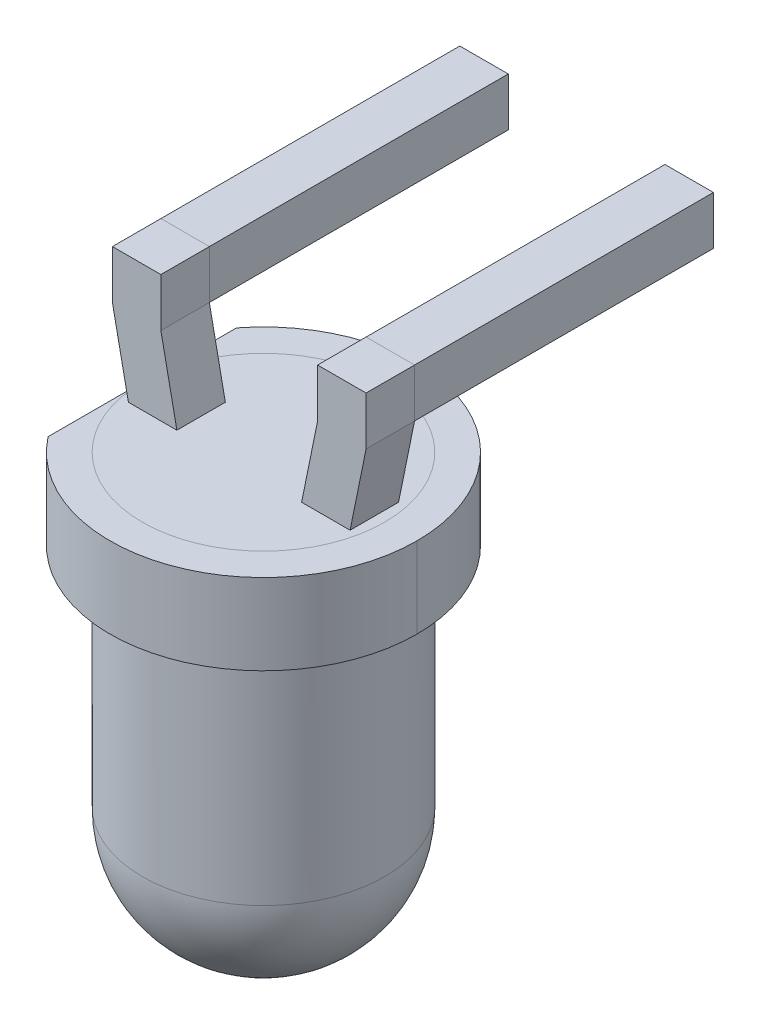
ISO-10303-21;
HEADER;
FILE_DESCRIPTION(('STEP AP214'),'2;1');
FILE_NAME('part.step','',(''),(''),'','','');
FILE_SCHEMA(('AUTOMOTIVE_DESIGN { 1 0 10303 214 1 1 1 1 }'));
ENDSEC;
DATA;
#1=APPLICATION_CONTEXT('core data for automotive mechanical design processes');
#2=APPLICATION_PROTOCOL_DEFINITION('international standard','automotive_design',2000,#1);
#3=PRODUCT_CONTEXT('',#1,'mechanical');
#4=PRODUCT('Part','Part','',(#3));
#5=PRODUCT_RELATED_PRODUCT_CATEGORY('part','',(#4));
#6=PRODUCT_DEFINITION_FORMATION('','',#4);
#7=PRODUCT_DEFINITION_CONTEXT('part definition',#1,'design');
#8=PRODUCT_DEFINITION('design','',#6,#7);
#9=PRODUCT_DEFINITION_SHAPE('','',#8);
#10=(LENGTH_UNIT() NAMED_UNIT(*) SI_UNIT(.MILLI.,.METRE.));
#11=(NAMED_UNIT(*) PLANE_ANGLE_UNIT() SI_UNIT($,.RADIAN.));
#12=(NAMED_UNIT(*) SI_UNIT($,.STERADIAN.) SOLID_ANGLE_UNIT());
#13=UNCERTAINTY_MEASURE_WITH_UNIT(LENGTH_MEASURE(1.E-05),#10,'distance_accuracy_value','');
#14=(GEOMETRIC_REPRESENTATION_CONTEXT(3) GLOBAL_UNCERTAINTY_ASSIGNED_CONTEXT((#13)) GLOBAL_UNIT_ASSIGNED_CONTEXT((#10,
#11,#12)) REPRESENTATION_CONTEXT('',''));
#15=CARTESIAN_POINT('',(0.,0.,0.));
#16=DIRECTION('',(0.,0.,1.));
#17=DIRECTION('',(1.,0.,0.));
#18=AXIS2_PLACEMENT_3D('',#15,#16,#17);
#19=CARTESIAN_POINT('',(2.84,0.3,-2.));
#20=DIRECTION('',(0.,0.,-1.));
#21=DIRECTION('',(0.,-1.,0.));
#22=AXIS2_PLACEMENT_3D('',#19,#20,#21);
#23=PLANE('',#22);
#24=DIRECTION('',(0.,1.,0.));
#25=VECTOR('',#24,1.);
#26=CARTESIAN_POINT('',(2.84,-0.3,-2.));
#27=LINE('',#26,#25);
#28=CARTESIAN_POINT('',(2.84,-0.3,-2.));
#29=VERTEX_POINT('',#28);
#30=CARTESIAN_POINT('',(2.84,0.3,-2.));
#31=VERTEX_POINT('',#30);
#32=EDGE_CURVE('E11',#29,#31,#27,.T.);
#33=ORIENTED_EDGE('',*,*,#32,.F.);
#34=DIRECTION('',(1.,0.,0.));
#35=VECTOR('',#34,1.);
#36=CARTESIAN_POINT('',(2.24,-0.3,-2.));
#37=LINE('',#36,#35);
#38=CARTESIAN_POINT('',(2.24,-0.3,-2.));
#39=VERTEX_POINT('',#38);
#40=EDGE_CURVE('E293',#39,#29,#37,.T.);
#41=ORIENTED_EDGE('',*,*,#40,.F.);
#42=DIRECTION('',(0.,-1.,0.));
#43=VECTOR('',#42,1.);
#44=CARTESIAN_POINT('',(2.24,0.3,-2.));
#45=LINE('',#44,#43);
#46=CARTESIAN_POINT('',(2.24,0.3,-2.));
#47=VERTEX_POINT('',#46);
#48=EDGE_CURVE('E27',#47,#39,#45,.T.);
#49=ORIENTED_EDGE('',*,*,#48,.F.);
#50=DIRECTION('',(-1.,0.,0.));
#51=VECTOR('',#50,1.);
#52=CARTESIAN_POINT('',(2.84,0.3,-2.));
#53=LINE('',#52,#51);
#54=EDGE_CURVE('E246',#31,#47,#53,.T.);
#55=ORIENTED_EDGE('',*,*,#54,.F.);
#56=EDGE_LOOP('',(#33,#41,#49,#55));
#57=FACE_BOUND('',#56,.T.);
#58=ADVANCED_FACE('F17',(#57),#23,.T.);
#59=CARTESIAN_POINT('',(2.84,-0.3,-2.));
#60=DIRECTION('',(-1.,0.,0.));
#61=DIRECTION('',(0.,0.,1.));
#62=AXIS2_PLACEMENT_3D('',#59,#60,#61);
#63=PLANE('',#62);
#64=ORIENTED_EDGE('',*,*,#32,.T.);
#65=DIRECTION('',(0.,0.,1.));
#66=VECTOR('',#65,1.);
#67=CARTESIAN_POINT('',(2.84,0.3,-2.));
#68=LINE('',#67,#66);
#69=CARTESIAN_POINT('',(2.84,0.3,1.7));
#70=VERTEX_POINT('',#69);
#71=EDGE_CURVE('E274',#31,#70,#68,.T.);
#72=ORIENTED_EDGE('',*,*,#71,.T.);
#73=DIRECTION('',(0.,-1.,0.));
#74=VECTOR('',#73,1.);
#75=CARTESIAN_POINT('',(2.84,0.3,1.7));
#76=LINE('',#75,#74);
#77=CARTESIAN_POINT('',(2.84,-0.3,1.7));
#78=VERTEX_POINT('',#77);
#79=EDGE_CURVE('E290',#70,#78,#76,.T.);
#80=ORIENTED_EDGE('',*,*,#79,.T.);
#81=DIRECTION('',(0.,0.,1.));
#82=VECTOR('',#81,1.);
#83=CARTESIAN_POINT('',(2.84,-0.3,-2.));
#84=LINE('',#83,#82);
#85=EDGE_CURVE('E398',#29,#78,#84,.T.);
#86=ORIENTED_EDGE('',*,*,#85,.F.);
#87=EDGE_LOOP('',(#64,#72,#80,#86));
#88=FACE_BOUND('',#87,.T.);
#89=ADVANCED_FACE('F500',(#88),#63,.F.);
#90=CARTESIAN_POINT('',(2.24,0.3,-2.));
#91=DIRECTION('',(1.,0.,0.));
#92=DIRECTION('',(0.,1.,0.));
#93=AXIS2_PLACEMENT_3D('',#90,#91,#92);
#94=PLANE('',#93);
#95=ORIENTED_EDGE('',*,*,#48,.T.);
#96=DIRECTION('',(0.,0.,1.));
#97=VECTOR('',#96,1.);
#98=CARTESIAN_POINT('',(2.24,-0.3,-2.));
#99=LINE('',#98,#97);
#100=CARTESIAN_POINT('',(2.24,-0.3,1.7));
#101=VERTEX_POINT('',#100);
#102=EDGE_CURVE('E402',#39,#101,#99,.T.);
#103=ORIENTED_EDGE('',*,*,#102,.T.);
#104=DIRECTION('',(0.,-1.,0.));
#105=VECTOR('',#104,1.);
#106=CARTESIAN_POINT('',(2.24,0.3,1.7));
#107=LINE('',#106,#105);
#108=CARTESIAN_POINT('',(2.24,0.3,1.7));
#109=VERTEX_POINT('',#108);
#110=EDGE_CURVE('E294',#109,#101,#107,.T.);
#111=ORIENTED_EDGE('',*,*,#110,.F.);
#112=DIRECTION('',(0.,0.,1.));
#113=VECTOR('',#112,1.);
#114=CARTESIAN_POINT('',(2.24,0.3,-2.));
#115=LINE('',#114,#113);
#116=EDGE_CURVE('E300',#47,#109,#115,.T.);
#117=ORIENTED_EDGE('',*,*,#116,.F.);
#118=EDGE_LOOP('',(#95,#103,#111,#117));
#119=FACE_BOUND('',#118,.T.);
#120=ADVANCED_FACE('F505',(#119),#94,.F.);
#121=CARTESIAN_POINT('',(2.84,0.3,-2.));
#122=DIRECTION('',(0.,-1.,0.));
#123=DIRECTION('',(0.,0.,-1.));
#124=AXIS2_PLACEMENT_3D('',#121,#122,#123);
#125=PLANE('',#124);
#126=ORIENTED_EDGE('',*,*,#54,.T.);
#127=ORIENTED_EDGE('',*,*,#116,.T.);
#128=DIRECTION('',(-1.,0.,0.));
#129=VECTOR('',#128,1.);
#130=CARTESIAN_POINT('',(2.84,0.3,1.7));
#131=LINE('',#130,#129);
#132=EDGE_CURVE('E967',#70,#109,#131,.T.);
#133=ORIENTED_EDGE('',*,*,#132,.F.);
#134=ORIENTED_EDGE('',*,*,#71,.F.);
#135=EDGE_LOOP('',(#126,#127,#133,#134));
#136=FACE_BOUND('',#135,.T.);
#137=ADVANCED_FACE('F513',(#136),#125,.F.);
#138=CARTESIAN_POINT('',(0.3,0.3,-2.));
#139=DIRECTION('',(0.,-1.,0.));
#140=DIRECTION('',(0.,0.,-1.));
#141=AXIS2_PLACEMENT_3D('',#138,#139,#140);
#142=PLANE('',#141);
#143=DIRECTION('',(-1.,0.,0.));
#144=VECTOR('',#143,1.);
#145=CARTESIAN_POINT('',(0.3,0.3,-2.));
#146=LINE('',#145,#144);
#147=CARTESIAN_POINT('',(0.3,0.3,-2.));
#148=VERTEX_POINT('',#147);
#149=CARTESIAN_POINT('',(-0.3,0.3,-2.));
#150=VERTEX_POINT('',#149);
#151=EDGE_CURVE('E234',#148,#150,#146,.T.);
#152=ORIENTED_EDGE('',*,*,#151,.T.);
#153=DIRECTION('',(0.,0.,1.));
#154=VECTOR('',#153,1.);
#155=CARTESIAN_POINT('',(-0.3,0.3,-2.));
#156=LINE('',#155,#154);
#157=CARTESIAN_POINT('',(-0.3,0.3,1.7));
#158=VERTEX_POINT('',#157);
#159=EDGE_CURVE('E238',#150,#158,#156,.T.);
#160=ORIENTED_EDGE('',*,*,#159,.T.);
#161=DIRECTION('',(-1.,0.,0.));
#162=VECTOR('',#161,1.);
#163=CARTESIAN_POINT('',(0.3,0.3,1.7));
#164=LINE('',#163,#162);
#165=CARTESIAN_POINT('',(0.3,0.3,1.7));
#166=VERTEX_POINT('',#165);
#167=EDGE_CURVE('E964',#166,#158,#164,.T.);
#168=ORIENTED_EDGE('',*,*,#167,.F.);
#169=DIRECTION('',(0.,0.,1.));
#170=VECTOR('',#169,1.);
#171=CARTESIAN_POINT('',(0.3,0.3,-2.));
#172=LINE('',#171,#170);
#173=EDGE_CURVE('E241',#148,#166,#172,.T.);
#174=ORIENTED_EDGE('',*,*,#173,.F.);
#175=EDGE_LOOP('',(#152,#160,#168,#174));
#176=FACE_BOUND('',#175,.T.);
#177=ADVANCED_FACE('F236',(#176),#142,.F.);
#178=CARTESIAN_POINT('',(0.3,0.3,-2.));
#179=DIRECTION('',(0.,0.,-1.));
#180=DIRECTION('',(0.,-1.,0.));
#181=AXIS2_PLACEMENT_3D('',#178,#179,#180);
#182=PLANE('',#181);
#183=DIRECTION('',(0.,1.,0.));
#184=VECTOR('',#183,1.);
#185=CARTESIAN_POINT('',(0.3,-0.3,-2.));
#186=LINE('',#185,#184);
#187=CARTESIAN_POINT('',(0.3,-0.3,-2.));
#188=VERTEX_POINT('',#187);
#189=EDGE_CURVE('E268',#188,#148,#186,.T.);
#190=ORIENTED_EDGE('',*,*,#189,.F.);
#191=DIRECTION('',(1.,0.,0.));
#192=VECTOR('',#191,1.);
#193=CARTESIAN_POINT('',(-0.3,-0.3,-2.));
#194=LINE('',#193,#192);
#195=CARTESIAN_POINT('',(-0.3,-0.3,-2.));
#196=VERTEX_POINT('',#195);
#197=EDGE_CURVE('E261',#196,#188,#194,.T.);
#198=ORIENTED_EDGE('',*,*,#197,.F.);
#199=DIRECTION('',(0.,-1.,0.));
#200=VECTOR('',#199,1.);
#201=CARTESIAN_POINT('',(-0.3,0.3,-2.));
#202=LINE('',#201,#200);
#203=EDGE_CURVE('E252',#150,#196,#202,.T.);
#204=ORIENTED_EDGE('',*,*,#203,.F.);
#205=ORIENTED_EDGE('',*,*,#151,.F.);
#206=EDGE_LOOP('',(#190,#198,#204,#205));
#207=FACE_BOUND('',#206,.T.);
#208=ADVANCED_FACE('F259',(#207),#182,.T.);
#209=CARTESIAN_POINT('',(-0.3,0.3,-2.));
#210=DIRECTION('',(1.,0.,0.));
#211=DIRECTION('',(0.,1.,0.));
#212=AXIS2_PLACEMENT_3D('',#209,#210,#211);
#213=PLANE('',#212);
#214=ORIENTED_EDGE('',*,*,#203,.T.);
#215=DIRECTION('',(0.,0.,1.));
#216=VECTOR('',#215,1.);
#217=CARTESIAN_POINT('',(-0.3,-0.3,-2.));
#218=LINE('',#217,#216);
#219=CARTESIAN_POINT('',(-0.3,-0.3,1.7));
#220=VERTEX_POINT('',#219);
#221=EDGE_CURVE('E372',#196,#220,#218,.T.);
#222=ORIENTED_EDGE('',*,*,#221,.T.);
#223=DIRECTION('',(0.,-1.,0.));
#224=VECTOR('',#223,1.);
#225=CARTESIAN_POINT('',(-0.3,0.3,1.7));
#226=LINE('',#225,#224);
#227=EDGE_CURVE('E255',#158,#220,#226,.T.);
#228=ORIENTED_EDGE('',*,*,#227,.F.);
#229=ORIENTED_EDGE('',*,*,#159,.F.);
#230=EDGE_LOOP('',(#214,#222,#228,#229));
#231=FACE_BOUND('',#230,.T.);
#232=ADVANCED_FACE('F250',(#231),#213,.F.);
#233=CARTESIAN_POINT('',(0.3,-0.3,-2.));
#234=DIRECTION('',(-1.,0.,0.));
#235=DIRECTION('',(0.,0.,1.));
#236=AXIS2_PLACEMENT_3D('',#233,#234,#235);
#237=PLANE('',#236);
#238=ORIENTED_EDGE('',*,*,#189,.T.);
#239=ORIENTED_EDGE('',*,*,#173,.T.);
#240=DIRECTION('',(0.,-1.,0.));
#241=VECTOR('',#240,1.);
#242=CARTESIAN_POINT('',(0.3,0.3,1.7));
#243=LINE('',#242,#241);
#244=CARTESIAN_POINT('',(0.3,-0.3,1.7));
#245=VERTEX_POINT('',#244);
#246=EDGE_CURVE('E299',#166,#245,#243,.T.);
#247=ORIENTED_EDGE('',*,*,#246,.T.);
#248=DIRECTION('',(0.,0.,1.));
#249=VECTOR('',#248,1.);
#250=CARTESIAN_POINT('',(0.3,-0.3,-2.));
#251=LINE('',#250,#249);
#252=EDGE_CURVE('E369',#188,#245,#251,.T.);
#253=ORIENTED_EDGE('',*,*,#252,.F.);
#254=EDGE_LOOP('',(#238,#239,#247,#253));
#255=FACE_BOUND('',#254,.T.);
#256=ADVANCED_FACE('F521',(#255),#237,.F.);
#257=CARTESIAN_POINT('',(2.24,-0.3,-2.));
#258=DIRECTION('',(0.,1.,0.));
#259=DIRECTION('',(1.,0.,0.));
#260=AXIS2_PLACEMENT_3D('',#257,#258,#259);
#261=PLANE('',#260);
#262=ORIENTED_EDGE('',*,*,#40,.T.);
#263=ORIENTED_EDGE('',*,*,#85,.T.);
#264=DIRECTION('',(1.,0.,0.));
#265=VECTOR('',#264,1.);
#266=CARTESIAN_POINT('',(2.24,-0.3,1.7));
#267=LINE('',#266,#265);
#268=EDGE_CURVE('E284',#101,#78,#267,.T.);
#269=ORIENTED_EDGE('',*,*,#268,.F.);
#270=ORIENTED_EDGE('',*,*,#102,.F.);
#271=EDGE_LOOP('',(#262,#263,#269,#270));
#272=FACE_BOUND('',#271,.T.);
#273=ADVANCED_FACE('F524',(#272),#261,.F.);
#274=CARTESIAN_POINT('',(2.84,0.3,1.7));
#275=DIRECTION('',(1.,0.,0.));
#276=DIRECTION('',(0.,1.,0.));
#277=AXIS2_PLACEMENT_3D('',#274,#275,#276);
#278=PLANE('',#277);
#279=DIRECTION('',(0.,0.,1.));
#280=VECTOR('',#279,1.);
#281=CARTESIAN_POINT('',(2.84,0.3,1.7));
#282=LINE('',#281,#280);
#283=CARTESIAN_POINT('',(2.84,0.3,2.3));
#284=VERTEX_POINT('',#283);
#285=EDGE_CURVE('E308',#70,#284,#282,.T.);
#286=ORIENTED_EDGE('',*,*,#285,.T.);
#287=DIRECTION('',(0.,-1.,0.));
#288=VECTOR('',#287,1.);
#289=CARTESIAN_POINT('',(2.84,0.3,2.3));
#290=LINE('',#289,#288);
#291=CARTESIAN_POINT('',(2.84,-0.3,2.3));
#292=VERTEX_POINT('',#291);
#293=EDGE_CURVE('E344',#284,#292,#290,.T.);
#294=ORIENTED_EDGE('',*,*,#293,.T.);
#295=DIRECTION('',(0.,0.,1.));
#296=VECTOR('',#295,1.);
#297=CARTESIAN_POINT('',(2.84,-0.3,1.7));
#298=LINE('',#297,#296);
#299=EDGE_CURVE('E289',#78,#292,#298,.T.);
#300=ORIENTED_EDGE('',*,*,#299,.F.);
#301=ORIENTED_EDGE('',*,*,#79,.F.);
#302=EDGE_LOOP('',(#286,#294,#300,#301));
#303=FACE_BOUND('',#302,.T.);
#304=ADVANCED_FACE('F532',(#303),#278,.T.);
#305=CARTESIAN_POINT('',(2.24,0.3,1.7));
#306=DIRECTION('',(1.,0.,0.));
#307=DIRECTION('',(0.,1.,0.));
#308=AXIS2_PLACEMENT_3D('',#305,#306,#307);
#309=PLANE('',#308);
#310=ORIENTED_EDGE('',*,*,#110,.T.);
#311=DIRECTION('',(0.,0.,1.));
#312=VECTOR('',#311,1.);
#313=CARTESIAN_POINT('',(2.24,-0.3,1.7));
#314=LINE('',#313,#312);
#315=CARTESIAN_POINT('',(2.24,-0.3,2.3));
#316=VERTEX_POINT('',#315);
#317=EDGE_CURVE('E146',#101,#316,#314,.T.);
#318=ORIENTED_EDGE('',*,*,#317,.T.);
#319=DIRECTION('',(0.,-1.,0.));
#320=VECTOR('',#319,1.);
#321=CARTESIAN_POINT('',(2.24,0.3,2.3));
#322=LINE('',#321,#320);
#323=CARTESIAN_POINT('',(2.24,0.3,2.3));
#324=VERTEX_POINT('',#323);
#325=EDGE_CURVE('E385',#324,#316,#322,.T.);
#326=ORIENTED_EDGE('',*,*,#325,.F.);
#327=DIRECTION('',(0.,0.,1.));
#328=VECTOR('',#327,1.);
#329=CARTESIAN_POINT('',(2.24,0.3,1.7));
#330=LINE('',#329,#328);
#331=EDGE_CURVE('E159',#109,#324,#330,.T.);
#332=ORIENTED_EDGE('',*,*,#331,.F.);
#333=EDGE_LOOP('',(#310,#318,#326,#332));
#334=FACE_BOUND('',#333,.T.);
#335=ADVANCED_FACE('F535',(#334),#309,.F.);
#336=CARTESIAN_POINT('',(2.84,0.3,1.7));
#337=DIRECTION('',(0.,-1.,0.));
#338=DIRECTION('',(0.,0.,-1.));
#339=AXIS2_PLACEMENT_3D('',#336,#337,#338);
#340=PLANE('',#339);
#341=ORIENTED_EDGE('',*,*,#132,.T.);
#342=ORIENTED_EDGE('',*,*,#331,.T.);
#343=DIRECTION('',(-1.,0.,0.));
#344=VECTOR('',#343,1.);
#345=CARTESIAN_POINT('',(2.84,0.3,2.3));
#346=LINE('',#345,#344);
#347=EDGE_CURVE('E347',#284,#324,#346,.T.);
#348=ORIENTED_EDGE('',*,*,#347,.F.);
#349=ORIENTED_EDGE('',*,*,#285,.F.);
#350=EDGE_LOOP('',(#341,#342,#348,#349));
#351=FACE_BOUND('',#350,.T.);
#352=ADVANCED_FACE('F530',(#351),#340,.F.);
#353=CARTESIAN_POINT('',(0.3,0.3,1.7));
#354=DIRECTION('',(0.,-1.,0.));
#355=DIRECTION('',(0.,0.,-1.));
#356=AXIS2_PLACEMENT_3D('',#353,#354,#355);
#357=PLANE('',#356);
#358=ORIENTED_EDGE('',*,*,#167,.T.);
#359=DIRECTION('',(0.,0.,1.));
#360=VECTOR('',#359,1.);
#361=CARTESIAN_POINT('',(-0.3,0.3,1.7));
#362=LINE('',#361,#360);
#363=CARTESIAN_POINT('',(-0.3,0.3,2.3));
#364=VERTEX_POINT('',#363);
#365=EDGE_CURVE('E554',#158,#364,#362,.T.);
#366=ORIENTED_EDGE('',*,*,#365,.T.);
#367=DIRECTION('',(-1.,0.,0.));
#368=VECTOR('',#367,1.);
#369=CARTESIAN_POINT('',(0.3,0.3,2.3));
#370=LINE('',#369,#368);
#371=CARTESIAN_POINT('',(0.3,0.3,2.3));
#372=VERTEX_POINT('',#371);
#373=EDGE_CURVE('E343',#372,#364,#370,.T.);
#374=ORIENTED_EDGE('',*,*,#373,.F.);
#375=DIRECTION('',(0.,0.,1.));
#376=VECTOR('',#375,1.);
#377=CARTESIAN_POINT('',(0.3,0.3,1.7));
#378=LINE('',#377,#376);
#379=EDGE_CURVE('E296',#166,#372,#378,.T.);
#380=ORIENTED_EDGE('',*,*,#379,.F.);
#381=EDGE_LOOP('',(#358,#366,#374,#380));
#382=FACE_BOUND('',#381,.T.);
#383=ADVANCED_FACE('F526',(#382),#357,.F.);
#384=CARTESIAN_POINT('',(-0.3,0.3,1.7));
#385=DIRECTION('',(1.,0.,0.));
#386=DIRECTION('',(0.,1.,0.));
#387=AXIS2_PLACEMENT_3D('',#384,#385,#386);
#388=PLANE('',#387);
#389=ORIENTED_EDGE('',*,*,#227,.T.);
#390=DIRECTION('',(0.,0.,1.));
#391=VECTOR('',#390,1.);
#392=CARTESIAN_POINT('',(-0.3,-0.3,1.7));
#393=LINE('',#392,#391);
#394=CARTESIAN_POINT('',(-0.3,-0.3,2.3));
#395=VERTEX_POINT('',#394);
#396=EDGE_CURVE('E390',#220,#395,#393,.T.);
#397=ORIENTED_EDGE('',*,*,#396,.T.);
#398=DIRECTION('',(0.,-1.,0.));
#399=VECTOR('',#398,1.);
#400=CARTESIAN_POINT('',(-0.3,0.3,2.3));
#401=LINE('',#400,#399);
#402=EDGE_CURVE('E338',#364,#395,#401,.T.);
#403=ORIENTED_EDGE('',*,*,#402,.F.);
#404=ORIENTED_EDGE('',*,*,#365,.F.);
#405=EDGE_LOOP('',(#389,#397,#403,#404));
#406=FACE_BOUND('',#405,.T.);
#407=ADVANCED_FACE('F529',(#406),#388,.F.);
#408=CARTESIAN_POINT('',(-0.3,-0.3,-2.));
#409=DIRECTION('',(0.,1.,0.));
#410=DIRECTION('',(1.,0.,0.));
#411=AXIS2_PLACEMENT_3D('',#408,#409,#410);
#412=PLANE('',#411);
#413=ORIENTED_EDGE('',*,*,#197,.T.);
#414=ORIENTED_EDGE('',*,*,#252,.T.);
#415=DIRECTION('',(1.,0.,0.));
#416=VECTOR('',#415,1.);
#417=CARTESIAN_POINT('',(-0.3,-0.3,1.7));
#418=LINE('',#417,#416);
#419=EDGE_CURVE('E423',#220,#245,#418,.T.);
#420=ORIENTED_EDGE('',*,*,#419,.F.);
#421=ORIENTED_EDGE('',*,*,#221,.F.);
#422=EDGE_LOOP('',(#413,#414,#420,#421));
#423=FACE_BOUND('',#422,.T.);
#424=ADVANCED_FACE('F542',(#423),#412,.F.);
#425=CARTESIAN_POINT('',(0.3,0.3,1.7));
#426=DIRECTION('',(1.,0.,0.));
#427=DIRECTION('',(0.,1.,0.));
#428=AXIS2_PLACEMENT_3D('',#425,#426,#427);
#429=PLANE('',#428);
#430=ORIENTED_EDGE('',*,*,#379,.T.);
#431=DIRECTION('',(0.,-1.,0.));
#432=VECTOR('',#431,1.);
#433=CARTESIAN_POINT('',(0.3,0.3,2.3));
#434=LINE('',#433,#432);
#435=CARTESIAN_POINT('',(0.3,-0.3,2.3));
#436=VERTEX_POINT('',#435);
#437=EDGE_CURVE('E358',#372,#436,#434,.T.);
#438=ORIENTED_EDGE('',*,*,#437,.T.);
#439=DIRECTION('',(0.,0.,1.));
#440=VECTOR('',#439,1.);
#441=CARTESIAN_POINT('',(0.3,-0.3,1.7));
#442=LINE('',#441,#440);
#443=EDGE_CURVE('E277',#245,#436,#442,.T.);
#444=ORIENTED_EDGE('',*,*,#443,.F.);
#445=ORIENTED_EDGE('',*,*,#246,.F.);
#446=EDGE_LOOP('',(#430,#438,#444,#445));
#447=FACE_BOUND('',#446,.T.);
#448=ADVANCED_FACE('F19',(#447),#429,.T.);
#449=CARTESIAN_POINT('',(1.27,-5.070000000002,2.));
#450=DIRECTION('',(0.,-1.,0.));
#451=DIRECTION('',(0.,0.,1.));
#452=AXIS2_PLACEMENT_3D('',#449,#450,#451);
#453=SPHERICAL_SURFACE('',#452,1.499999999998);
#454=CARTESIAN_POINT('',(1.27,-5.07,2.));
#455=DIRECTION('',(0.,-1.,0.));
#456=DIRECTION('',(0.,0.,1.));
#457=AXIS2_PLACEMENT_3D('',#454,#455,#456);
#458=CIRCLE('',#457,1.499999999999);
#459=CARTESIAN_POINT('',(1.27,-5.07,3.499999999999));
#460=VERTEX_POINT('',#459);
#461=EDGE_CURVE('E278',#460,#460,#458,.T.);
#462=ORIENTED_EDGE('',*,*,#461,.T.);
#463=CARTESIAN_POINT('',(1.27,-5.070000000002,2.));
#464=DIRECTION('',(1.,0.,0.));
#465=DIRECTION('',(0.,1.,0.));
#466=AXIS2_PLACEMENT_3D('',#463,#464,#465);
#467=CIRCLE('',#466,1.499999999998);
#468=CARTESIAN_POINT('',(1.27,-6.57,2.));
#469=VERTEX_POINT('',#468);
#470=EDGE_CURVE('E288',#460,#469,#467,.T.);
#471=ORIENTED_EDGE('',*,*,#470,.T.);
#472=ORIENTED_EDGE('',*,*,#470,.F.);
#473=EDGE_LOOP('',(#462,#471,#472));
#474=FACE_BOUND('',#473,.T.);
#475=ADVANCED_FACE('F613',(#474),#453,.T.);
#476=CARTESIAN_POINT('',(2.84,0.3,1.7));
#477=DIRECTION('',(0.,0.,-1.));
#478=DIRECTION('',(0.,-1.,0.));
#479=AXIS2_PLACEMENT_3D('',#476,#477,#478);
#480=PLANE('',#479);
#481=DIRECTION('',(-0.19996001199608,-0.979804058780391,0.));
#482=VECTOR('',#481,1.);
#483=CARTESIAN_POINT('',(2.24,-0.3,1.7));
#484=LINE('',#483,#482);
#485=CARTESIAN_POINT('',(2.042040816327,-1.27,1.7));
#486=VERTEX_POINT('',#485);
#487=EDGE_CURVE('E322',#101,#486,#484,.T.);
#488=ORIENTED_EDGE('',*,*,#487,.F.);
#489=ORIENTED_EDGE('',*,*,#268,.T.);
#490=DIRECTION('',(-0.19996001199608,-0.979804058780391,0.));
#491=VECTOR('',#490,1.);
#492=CARTESIAN_POINT('',(2.84,-0.3,1.7));
#493=LINE('',#492,#491);
#494=CARTESIAN_POINT('',(2.642040816327,-1.27,1.7));
#495=VERTEX_POINT('',#494);
#496=EDGE_CURVE('E321',#78,#495,#493,.T.);
#497=ORIENTED_EDGE('',*,*,#496,.T.);
#498=DIRECTION('',(1.,0.,0.));
#499=VECTOR('',#498,1.);
#500=CARTESIAN_POINT('',(2.055,-1.27,1.7));
#501=LINE('',#500,#499);
#502=EDGE_CURVE('E336',#486,#495,#501,.T.);
#503=ORIENTED_EDGE('',*,*,#502,.F.);
#504=EDGE_LOOP('',(#488,#489,#497,#503));
#505=FACE_BOUND('',#504,.T.);
#506=ADVANCED_FACE('F604',(#505),#480,.T.);
#507=CARTESIAN_POINT('',(2.84,-0.3,1.7));
#508=DIRECTION('',(0.979804058780391,-0.19996001199608,0.));
#509=DIRECTION('',(0.,0.,-1.));
#510=AXIS2_PLACEMENT_3D('',#507,#508,#509);
#511=PLANE('',#510);
#512=ORIENTED_EDGE('',*,*,#496,.F.);
#513=ORIENTED_EDGE('',*,*,#299,.T.);
#514=DIRECTION('',(-0.19996001199608,-0.979804058780391,0.));
#515=VECTOR('',#514,1.);
#516=CARTESIAN_POINT('',(2.84,-0.3,2.3));
#517=LINE('',#516,#515);
#518=CARTESIAN_POINT('',(2.642040816327,-1.27,2.3));
#519=VERTEX_POINT('',#518);
#520=EDGE_CURVE('E348',#292,#519,#517,.T.);
#521=ORIENTED_EDGE('',*,*,#520,.T.);
#522=DIRECTION('',(0.,0.,1.));
#523=VECTOR('',#522,1.);
#524=CARTESIAN_POINT('',(2.642040816327,-1.27,1.85));
#525=LINE('',#524,#523);
#526=EDGE_CURVE('E382',#495,#519,#525,.T.);
#527=ORIENTED_EDGE('',*,*,#526,.F.);
#528=EDGE_LOOP('',(#512,#513,#521,#527));
#529=FACE_BOUND('',#528,.T.);
#530=ADVANCED_FACE('F601',(#529),#511,.T.);
#531=CARTESIAN_POINT('',(2.24,-0.3,1.7));
#532=DIRECTION('',(0.979804058780391,-0.19996001199608,0.));
#533=DIRECTION('',(0.,0.,-1.));
#534=AXIS2_PLACEMENT_3D('',#531,#532,#533);
#535=PLANE('',#534);
#536=DIRECTION('',(0.,0.,1.));
#537=VECTOR('',#536,1.);
#538=CARTESIAN_POINT('',(2.042040816327,-1.27,1.85));
#539=LINE('',#538,#537);
#540=CARTESIAN_POINT('',(2.042040816327,-1.27,2.3));
#541=VERTEX_POINT('',#540);
#542=EDGE_CURVE('E332',#486,#541,#539,.T.);
#543=ORIENTED_EDGE('',*,*,#542,.T.);
#544=DIRECTION('',(-0.19996001199608,-0.979804058780391,0.));
#545=VECTOR('',#544,1.);
#546=CARTESIAN_POINT('',(2.24,-0.3,2.3));
#547=LINE('',#546,#545);
#548=EDGE_CURVE('E389',#316,#541,#547,.T.);
#549=ORIENTED_EDGE('',*,*,#548,.F.);
#550=ORIENTED_EDGE('',*,*,#317,.F.);
#551=ORIENTED_EDGE('',*,*,#487,.T.);
#552=EDGE_LOOP('',(#543,#549,#550,#551));
#553=FACE_BOUND('',#552,.T.);
#554=ADVANCED_FACE('F599',(#553),#535,.F.);
#555=CARTESIAN_POINT('',(2.84,0.3,2.3));
#556=DIRECTION('',(0.,0.,-1.));
#557=DIRECTION('',(0.,-1.,0.));
#558=AXIS2_PLACEMENT_3D('',#555,#556,#557);
#559=PLANE('',#558);
#560=ORIENTED_EDGE('',*,*,#325,.T.);
#561=ORIENTED_EDGE('',*,*,#548,.T.);
#562=DIRECTION('',(1.,0.,0.));
#563=VECTOR('',#562,1.);
#564=CARTESIAN_POINT('',(2.055,-1.27,2.3));
#565=LINE('',#564,#563);
#566=EDGE_CURVE('E337',#541,#519,#565,.T.);
#567=ORIENTED_EDGE('',*,*,#566,.T.);
#568=ORIENTED_EDGE('',*,*,#520,.F.);
#569=ORIENTED_EDGE('',*,*,#293,.F.);
#570=ORIENTED_EDGE('',*,*,#347,.T.);
#571=EDGE_LOOP('',(#560,#561,#567,#568,#569,#570));
#572=FACE_BOUND('',#571,.T.);
#573=ADVANCED_FACE('F594',(#572),#559,.F.);
#574=CARTESIAN_POINT('',(-0.3,-0.3,1.7));
#575=DIRECTION('',(0.979804058780391,0.19996001199608,0.));
#576=DIRECTION('',(0.,0.,-1.));
#577=AXIS2_PLACEMENT_3D('',#574,#575,#576);
#578=PLANE('',#577);
#579=DIRECTION('',(0.,0.,1.));
#580=VECTOR('',#579,1.);
#581=CARTESIAN_POINT('',(-0.102040816327,-1.27,1.85));
#582=LINE('',#581,#580);
#583=CARTESIAN_POINT('',(-0.102040816327,-1.27,1.7));
#584=VERTEX_POINT('',#583);
#585=CARTESIAN_POINT('',(-0.102040816327,-1.27,2.3));
#586=VERTEX_POINT('',#585);
#587=EDGE_CURVE('E376',#584,#586,#582,.T.);
#588=ORIENTED_EDGE('',*,*,#587,.T.);
#589=DIRECTION('',(0.19996001199608,-0.979804058780391,0.));
#590=VECTOR('',#589,1.);
#591=CARTESIAN_POINT('',(-0.3,-0.3,2.3));
#592=LINE('',#591,#590);
#593=EDGE_CURVE('E342',#395,#586,#592,.T.);
#594=ORIENTED_EDGE('',*,*,#593,.F.);
#595=ORIENTED_EDGE('',*,*,#396,.F.);
#596=DIRECTION('',(0.19996001199608,-0.979804058780391,0.));
#597=VECTOR('',#596,1.);
#598=CARTESIAN_POINT('',(-0.3,-0.3,1.7));
#599=LINE('',#598,#597);
#600=EDGE_CURVE('E328',#220,#584,#599,.T.);
#601=ORIENTED_EDGE('',*,*,#600,.T.);
#602=EDGE_LOOP('',(#588,#594,#595,#601));
#603=FACE_BOUND('',#602,.T.);
#604=ADVANCED_FACE('F559',(#603),#578,.F.);
#605=CARTESIAN_POINT('',(0.3,0.3,2.3));
#606=DIRECTION('',(0.,0.,1.));
#607=DIRECTION('',(1.,0.,0.));
#608=AXIS2_PLACEMENT_3D('',#605,#606,#607);
#609=PLANE('',#608);
#610=ORIENTED_EDGE('',*,*,#437,.F.);
#611=ORIENTED_EDGE('',*,*,#373,.T.);
#612=ORIENTED_EDGE('',*,*,#402,.T.);
#613=ORIENTED_EDGE('',*,*,#593,.T.);
#614=DIRECTION('',(-1.,0.,0.));
#615=VECTOR('',#614,1.);
#616=CARTESIAN_POINT('',(0.785,-1.27,2.3));
#617=LINE('',#616,#615);
#618=CARTESIAN_POINT('',(0.497959183673,-1.27,2.3));
#619=VERTEX_POINT('',#618);
#620=EDGE_CURVE('E368',#619,#586,#617,.T.);
#621=ORIENTED_EDGE('',*,*,#620,.F.);
#622=DIRECTION('',(0.19996001199608,-0.979804058780391,0.));
#623=VECTOR('',#622,1.);
#624=CARTESIAN_POINT('',(0.3,-0.3,2.3));
#625=LINE('',#624,#623);
#626=EDGE_CURVE('E119',#436,#619,#625,.T.);
#627=ORIENTED_EDGE('',*,*,#626,.F.);
#628=EDGE_LOOP('',(#610,#611,#612,#613,#621,#627));
#629=FACE_BOUND('',#628,.T.);
#630=ADVANCED_FACE('F519',(#629),#609,.T.);
#631=CARTESIAN_POINT('',(0.3,0.3,1.7));
#632=DIRECTION('',(0.,0.,1.));
#633=DIRECTION('',(1.,0.,0.));
#634=AXIS2_PLACEMENT_3D('',#631,#632,#633);
#635=PLANE('',#634);
#636=DIRECTION('',(-1.,0.,0.));
#637=VECTOR('',#636,1.);
#638=CARTESIAN_POINT('',(0.785,-1.27,1.7));
#639=LINE('',#638,#637);
#640=CARTESIAN_POINT('',(0.497959183673,-1.27,1.7));
#641=VERTEX_POINT('',#640);
#642=EDGE_CURVE('E373',#641,#584,#639,.T.);
#643=ORIENTED_EDGE('',*,*,#642,.T.);
#644=ORIENTED_EDGE('',*,*,#600,.F.);
#645=ORIENTED_EDGE('',*,*,#419,.T.);
#646=DIRECTION('',(0.19996001199608,-0.979804058780391,0.));
#647=VECTOR('',#646,1.);
#648=CARTESIAN_POINT('',(0.3,-0.3,1.7));
#649=LINE('',#648,#647);
#650=EDGE_CURVE('E135',#245,#641,#649,.T.);
#651=ORIENTED_EDGE('',*,*,#650,.T.);
#652=EDGE_LOOP('',(#643,#644,#645,#651));
#653=FACE_BOUND('',#652,.T.);
#654=ADVANCED_FACE('F517',(#653),#635,.F.);
#655=CARTESIAN_POINT('',(0.3,-0.3,1.7));
#656=DIRECTION('',(0.979804058780391,0.19996001199608,0.));
#657=DIRECTION('',(0.,0.,-1.));
#658=AXIS2_PLACEMENT_3D('',#655,#656,#657);
#659=PLANE('',#658);
#660=ORIENTED_EDGE('',*,*,#650,.F.);
#661=ORIENTED_EDGE('',*,*,#443,.T.);
#662=ORIENTED_EDGE('',*,*,#626,.T.);
#663=DIRECTION('',(0.,0.,1.));
#664=VECTOR('',#663,1.);
#665=CARTESIAN_POINT('',(0.497959183673,-1.27,1.85));
#666=LINE('',#665,#664);
#667=EDGE_CURVE('E364',#641,#619,#666,.T.);
#668=ORIENTED_EDGE('',*,*,#667,.F.);
#669=EDGE_LOOP('',(#660,#661,#662,#668));
#670=FACE_BOUND('',#669,.T.);
#671=ADVANCED_FACE('F492',(#670),#659,.T.);
#672=CARTESIAN_POINT('',(1.27,-1.27,2.));
#673=DIRECTION('',(0.,-1.,0.));
#674=DIRECTION('',(0.,0.,1.));
#675=AXIS2_PLACEMENT_3D('',#672,#673,#674);
#676=CYLINDRICAL_SURFACE('',#675,1.5);
#677=CARTESIAN_POINT('',(1.27,-2.27,2.));
#678=DIRECTION('',(0.,-1.,0.));
#679=DIRECTION('',(1.,0.,0.));
#680=AXIS2_PLACEMENT_3D('',#677,#678,#679);
#681=CIRCLE('',#680,1.5);
#682=CARTESIAN_POINT('',(2.77,-2.27,2.));
#683=VERTEX_POINT('',#682);
#684=CARTESIAN_POINT('',(1.27,-2.27,3.5));
#685=VERTEX_POINT('',#684);
#686=EDGE_CURVE('E430',#683,#685,#681,.T.);
#687=ORIENTED_EDGE('',*,*,#686,.T.);
#688=DIRECTION('',(0.,-1.,0.));
#689=VECTOR('',#688,1.);
#690=CARTESIAN_POINT('',(1.27,-1.27,3.5));
#691=LINE('',#690,#689);
#692=EDGE_CURVE('E958',#685,#460,#691,.T.);
#693=ORIENTED_EDGE('',*,*,#692,.T.);
#694=ORIENTED_EDGE('',*,*,#461,.F.);
#695=ORIENTED_EDGE('',*,*,#692,.F.);
#696=CARTESIAN_POINT('',(1.27,-2.27,2.));
#697=DIRECTION('',(0.,-1.,0.));
#698=DIRECTION('',(1.,0.,0.));
#699=AXIS2_PLACEMENT_3D('',#696,#697,#698);
#700=CIRCLE('',#699,1.5);
#701=CARTESIAN_POINT('',(-0.23,-2.27,2.));
#702=VERTEX_POINT('',#701);
#703=EDGE_CURVE('E426',#685,#702,#700,.T.);
#704=ORIENTED_EDGE('',*,*,#703,.T.);
#705=CARTESIAN_POINT('',(1.27,-2.27,2.));
#706=DIRECTION('',(0.,-1.,0.));
#707=DIRECTION('',(1.,0.,0.));
#708=AXIS2_PLACEMENT_3D('',#705,#706,#707);
#709=CIRCLE('',#708,1.5);
#710=EDGE_CURVE('E394',#702,#683,#709,.T.);
#711=ORIENTED_EDGE('',*,*,#710,.T.);
#712=EDGE_LOOP('',(#687,#693,#694,#695,#704,#711));
#713=FACE_BOUND('',#712,.T.);
#714=ADVANCED_FACE('F483',(#713),#676,.T.);
#715=CARTESIAN_POINT('',(1.27,-1.27,2.));
#716=DIRECTION('',(0.,1.,0.));
#717=DIRECTION('',(1.,0.,0.));
#718=AXIS2_PLACEMENT_3D('',#715,#716,#717);
#719=PLANE('',#718);
#720=ORIENTED_EDGE('',*,*,#566,.F.);
#721=ORIENTED_EDGE('',*,*,#542,.F.);
#722=ORIENTED_EDGE('',*,*,#502,.T.);
#723=ORIENTED_EDGE('',*,*,#526,.T.);
#724=EDGE_LOOP('',(#720,#721,#722,#723));
#725=FACE_BOUND('',#724,.T.);
#726=ORIENTED_EDGE('',*,*,#667,.T.);
#727=ORIENTED_EDGE('',*,*,#620,.T.);
#728=ORIENTED_EDGE('',*,*,#587,.F.);
#729=ORIENTED_EDGE('',*,*,#642,.F.);
#730=EDGE_LOOP('',(#726,#727,#728,#729));
#731=FACE_BOUND('',#730,.T.);
#732=CARTESIAN_POINT('',(1.27,-1.27,2.));
#733=DIRECTION('',(0.,-1.,0.));
#734=DIRECTION('',(1.,0.,0.));
#735=AXIS2_PLACEMENT_3D('',#732,#733,#734);
#736=CIRCLE('',#735,1.5);
#737=CARTESIAN_POINT('',(1.27,-1.27,3.5));
#738=VERTEX_POINT('',#737);
#739=CARTESIAN_POINT('',(-0.23,-1.27,1.999999978232));
#740=VERTEX_POINT('',#739);
#741=EDGE_CURVE('E407',#738,#740,#736,.T.);
#742=ORIENTED_EDGE('',*,*,#741,.F.);
#743=CARTESIAN_POINT('',(1.27,-1.27,2.));
#744=DIRECTION('',(0.,-1.,0.));
#745=DIRECTION('',(1.,0.,0.));
#746=AXIS2_PLACEMENT_3D('',#743,#744,#745);
#747=CIRCLE('',#746,1.5);
#748=CARTESIAN_POINT('',(2.77,-1.27,2.));
#749=VERTEX_POINT('',#748);
#750=EDGE_CURVE('E403',#749,#738,#747,.T.);
#751=ORIENTED_EDGE('',*,*,#750,.F.);
#752=CARTESIAN_POINT('',(1.27,-1.27,2.));
#753=DIRECTION('',(0.,-1.,0.));
#754=DIRECTION('',(1.,0.,0.));
#755=AXIS2_PLACEMENT_3D('',#752,#753,#754);
#756=CIRCLE('',#755,1.5);
#757=EDGE_CURVE('E408',#740,#749,#756,.T.);
#758=ORIENTED_EDGE('',*,*,#757,.F.);
#759=EDGE_LOOP('',(#742,#751,#758));
#760=FACE_BOUND('',#759,.T.);
#761=ADVANCED_FACE('F480',(#725,#731,#760),#719,.T.);
#762=CARTESIAN_POINT('',(-0.23,-2.27,3.9));
#763=DIRECTION('',(-1.,0.,0.));
#764=DIRECTION('',(0.,1.,0.));
#765=AXIS2_PLACEMENT_3D('',#762,#763,#764);
#766=PLANE('',#765);
#767=DIRECTION('',(0.,0.,-1.));
#768=VECTOR('',#767,1.);
#769=CARTESIAN_POINT('',(-0.23,-2.27,3.9));
#770=LINE('',#769,#768);
#771=CARTESIAN_POINT('',(-0.23,-2.27,0.833809621031));
#772=VERTEX_POINT('',#771);
#773=EDGE_CURVE('E307',#702,#772,#770,.T.);
#774=ORIENTED_EDGE('',*,*,#773,.F.);
#775=DIRECTION('',(0.,1.,0.));
#776=VECTOR('',#775,1.);
#777=CARTESIAN_POINT('',(-0.23,-1.27,2.));
#778=LINE('',#777,#776);
#779=EDGE_CURVE('E40',#702,#740,#778,.T.);
#780=ORIENTED_EDGE('',*,*,#779,.T.);
#781=DIRECTION('',(0.,0.,1.));
#782=VECTOR('',#781,1.);
#783=CARTESIAN_POINT('',(-0.23,-1.27,2.95));
#784=LINE('',#783,#782);
#785=CARTESIAN_POINT('',(-0.23,-1.27,0.833809621031));
#786=VERTEX_POINT('',#785);
#787=EDGE_CURVE('E282',#786,#740,#784,.T.);
#788=ORIENTED_EDGE('',*,*,#787,.F.);
#789=DIRECTION('',(0.,1.,0.));
#790=VECTOR('',#789,1.);
#791=CARTESIAN_POINT('',(-0.23,-1.27,0.833809621031));
#792=LINE('',#791,#790);
#793=EDGE_CURVE('E306',#772,#786,#792,.T.);
#794=ORIENTED_EDGE('',*,*,#793,.F.);
#795=EDGE_LOOP('',(#774,#780,#788,#794));
#796=FACE_BOUND('',#795,.T.);
#797=ADVANCED_FACE('F482',(#796),#766,.T.);
#798=CARTESIAN_POINT('',(1.27,-1.27,2.));
#799=DIRECTION('',(0.,1.,0.));
#800=DIRECTION('',(1.,0.,0.));
#801=AXIS2_PLACEMENT_3D('',#798,#799,#800);
#802=CYLINDRICAL_SURFACE('',#801,1.9);
#803=CARTESIAN_POINT('',(1.27,-2.27,2.));
#804=DIRECTION('',(0.,-1.,0.));
#805=DIRECTION('',(1.,0.,0.));
#806=AXIS2_PLACEMENT_3D('',#803,#804,#805);
#807=CIRCLE('',#806,1.9);
#808=CARTESIAN_POINT('',(3.17,-2.27,2.));
#809=VERTEX_POINT('',#808);
#810=EDGE_CURVE('E303',#772,#809,#807,.T.);
#811=ORIENTED_EDGE('',*,*,#810,.F.);
#812=ORIENTED_EDGE('',*,*,#793,.T.);
#813=CARTESIAN_POINT('',(1.27,-1.27,2.));
#814=DIRECTION('',(0.,-1.,0.));
#815=DIRECTION('',(1.,0.,0.));
#816=AXIS2_PLACEMENT_3D('',#813,#814,#815);
#817=CIRCLE('',#816,1.9);
#818=CARTESIAN_POINT('',(3.17,-1.27,2.));
#819=VERTEX_POINT('',#818);
#820=EDGE_CURVE('E279',#786,#819,#817,.T.);
#821=ORIENTED_EDGE('',*,*,#820,.T.);
#822=DIRECTION('',(0.,-1.,0.));
#823=VECTOR('',#822,1.);
#824=CARTESIAN_POINT('',(3.17,-1.27,2.));
#825=LINE('',#824,#823);
#826=EDGE_CURVE('E315',#819,#809,#825,.T.);
#827=ORIENTED_EDGE('',*,*,#826,.T.);
#828=EDGE_LOOP('',(#811,#812,#821,#827));
#829=FACE_BOUND('',#828,.T.);
#830=ADVANCED_FACE('F477',(#829),#802,.T.);
#831=CARTESIAN_POINT('',(3.17,-2.27,2.));
#832=DIRECTION('',(0.,1.,0.));
#833=DIRECTION('',(0.,0.,-1.));
#834=AXIS2_PLACEMENT_3D('',#831,#832,#833);
#835=PLANE('',#834);
#836=DIRECTION('',(0.,0.,-1.));
#837=VECTOR('',#836,1.);
#838=CARTESIAN_POINT('',(-0.23,-2.27,3.9));
#839=LINE('',#838,#837);
#840=CARTESIAN_POINT('',(-0.23,-2.27,3.166190378969));
#841=VERTEX_POINT('',#840);
#842=EDGE_CURVE('E359',#841,#702,#839,.T.);
#843=ORIENTED_EDGE('',*,*,#842,.T.);
#844=ORIENTED_EDGE('',*,*,#703,.F.);
#845=ORIENTED_EDGE('',*,*,#686,.F.);
#846=ORIENTED_EDGE('',*,*,#710,.F.);
#847=ORIENTED_EDGE('',*,*,#773,.T.);
#848=ORIENTED_EDGE('',*,*,#810,.T.);
#849=CARTESIAN_POINT('',(1.27,-2.27,2.));
#850=DIRECTION('',(0.,-1.,0.));
#851=DIRECTION('',(1.,0.,0.));
#852=AXIS2_PLACEMENT_3D('',#849,#850,#851);
#853=CIRCLE('',#852,1.9);
#854=EDGE_CURVE('E311',#809,#841,#853,.T.);
#855=ORIENTED_EDGE('',*,*,#854,.T.);
#856=EDGE_LOOP('',(#843,#844,#845,#846,#847,#848,#855));
#857=FACE_BOUND('',#856,.T.);
#858=ADVANCED_FACE('F473',(#857),#835,.F.);
#859=CARTESIAN_POINT('',(-0.23,-2.27,3.9));
#860=DIRECTION('',(-1.,0.,0.));
#861=DIRECTION('',(0.,1.,0.));
#862=AXIS2_PLACEMENT_3D('',#859,#860,#861);
#863=PLANE('',#862);
#864=ORIENTED_EDGE('',*,*,#842,.F.);
#865=DIRECTION('',(0.,1.,0.));
#866=VECTOR('',#865,1.);
#867=CARTESIAN_POINT('',(-0.23,-1.27,3.166190378969));
#868=LINE('',#867,#866);
#869=CARTESIAN_POINT('',(-0.23,-1.27,3.166190378969));
#870=VERTEX_POINT('',#869);
#871=EDGE_CURVE('E316',#841,#870,#868,.T.);
#872=ORIENTED_EDGE('',*,*,#871,.T.);
#873=DIRECTION('',(0.,0.,1.));
#874=VECTOR('',#873,1.);
#875=CARTESIAN_POINT('',(-0.23,-1.27,2.95));
#876=LINE('',#875,#874);
#877=EDGE_CURVE('E363',#740,#870,#876,.T.);
#878=ORIENTED_EDGE('',*,*,#877,.F.);
#879=ORIENTED_EDGE('',*,*,#779,.F.);
#880=EDGE_LOOP('',(#864,#872,#878,#879));
#881=FACE_BOUND('',#880,.T.);
#882=ADVANCED_FACE('F470',(#881),#863,.T.);
#883=CARTESIAN_POINT('',(3.17,-1.27,2.));
#884=DIRECTION('',(0.,1.,0.));
#885=DIRECTION('',(0.,0.,-1.));
#886=AXIS2_PLACEMENT_3D('',#883,#884,#885);
#887=PLANE('',#886);
#888=CARTESIAN_POINT('',(1.27,-1.27,2.));
#889=DIRECTION('',(0.,-1.,0.));
#890=DIRECTION('',(1.,0.,0.));
#891=AXIS2_PLACEMENT_3D('',#888,#889,#890);
#892=CIRCLE('',#891,1.9);
#893=EDGE_CURVE('E283',#819,#870,#892,.T.);
#894=ORIENTED_EDGE('',*,*,#893,.F.);
#895=ORIENTED_EDGE('',*,*,#820,.F.);
#896=ORIENTED_EDGE('',*,*,#787,.T.);
#897=ORIENTED_EDGE('',*,*,#757,.T.);
#898=ORIENTED_EDGE('',*,*,#750,.T.);
#899=ORIENTED_EDGE('',*,*,#741,.T.);
#900=ORIENTED_EDGE('',*,*,#877,.T.);
#901=EDGE_LOOP('',(#894,#895,#896,#897,#898,#899,#900));
#902=FACE_BOUND('',#901,.T.);
#903=ADVANCED_FACE('F462',(#902),#887,.T.);
#904=CARTESIAN_POINT('',(1.27,-1.27,2.));
#905=DIRECTION('',(0.,1.,0.));
#906=DIRECTION('',(1.,0.,0.));
#907=AXIS2_PLACEMENT_3D('',#904,#905,#906);
#908=CYLINDRICAL_SURFACE('',#907,1.9);
#909=ORIENTED_EDGE('',*,*,#871,.F.);
#910=ORIENTED_EDGE('',*,*,#854,.F.);
#911=ORIENTED_EDGE('',*,*,#826,.F.);
#912=ORIENTED_EDGE('',*,*,#893,.T.);
#913=EDGE_LOOP('',(#909,#910,#911,#912));
#914=FACE_BOUND('',#913,.T.);
#915=ADVANCED_FACE('F468',(#914),#908,.T.);
#916=CLOSED_SHELL('',(#58,#89,#120,#137,#177,#208,#232,#256,#273,#304,#335,#352,#383,#407,#424,
#448,#475,#506,#530,#554,#573,#604,#630,#654,#671,#714,#761,#797,#830,#858,#882,#903,#915));
#917=MANIFOLD_SOLID_BREP('B1',#916);
#918=ADVANCED_BREP_SHAPE_REPRESENTATION('',(#18,#917),#14);
#919=SHAPE_DEFINITION_REPRESENTATION(#9,#918);
ENDSEC;
END-ISO-10303-21;
